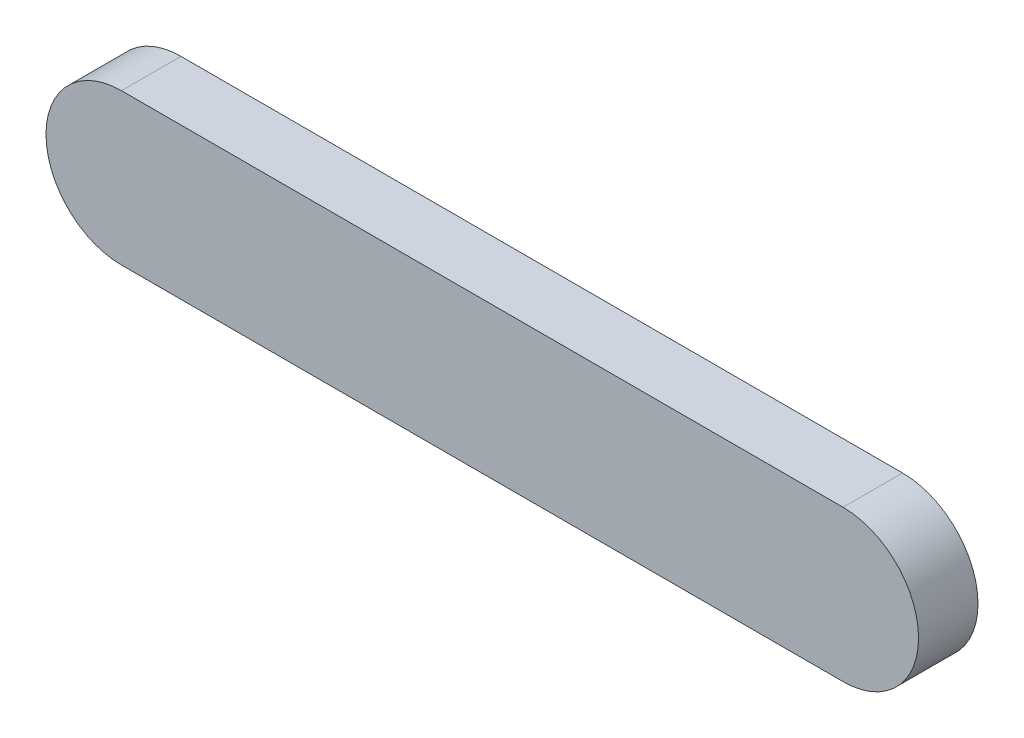
ISO-10303-21;
HEADER;
FILE_DESCRIPTION(('STEP AP214'),'2;1');
FILE_NAME('part.step','',(''),(''),'','','');
FILE_SCHEMA(('AUTOMOTIVE_DESIGN { 1 0 10303 214 1 1 1 1 }'));
ENDSEC;
DATA;
#1=APPLICATION_CONTEXT('core data for automotive mechanical design processes');
#2=APPLICATION_PROTOCOL_DEFINITION('international standard','automotive_design',2000,#1);
#3=PRODUCT_CONTEXT('',#1,'mechanical');
#4=PRODUCT('Part','Part','',(#3));
#5=PRODUCT_RELATED_PRODUCT_CATEGORY('part','',(#4));
#6=PRODUCT_DEFINITION_FORMATION('','',#4);
#7=PRODUCT_DEFINITION_CONTEXT('part definition',#1,'design');
#8=PRODUCT_DEFINITION('design','',#6,#7);
#9=PRODUCT_DEFINITION_SHAPE('','',#8);
#10=(LENGTH_UNIT() NAMED_UNIT(*) SI_UNIT(.MILLI.,.METRE.));
#11=(NAMED_UNIT(*) PLANE_ANGLE_UNIT() SI_UNIT($,.RADIAN.));
#12=(NAMED_UNIT(*) SI_UNIT($,.STERADIAN.) SOLID_ANGLE_UNIT());
#13=UNCERTAINTY_MEASURE_WITH_UNIT(LENGTH_MEASURE(1.E-05),#10,'distance_accuracy_value','');
#14=(GEOMETRIC_REPRESENTATION_CONTEXT(3) GLOBAL_UNCERTAINTY_ASSIGNED_CONTEXT((#13)) GLOBAL_UNIT_ASSIGNED_CONTEXT((#10,
#11,#12)) REPRESENTATION_CONTEXT('',''));
#15=CARTESIAN_POINT('',(0.,0.,0.));
#16=DIRECTION('',(0.,0.,1.));
#17=DIRECTION('',(1.,0.,0.));
#18=AXIS2_PLACEMENT_3D('',#15,#16,#17);
#19=CARTESIAN_POINT('',(149.3012,56.388,0.));
#20=DIRECTION('',(0.,1.,0.));
#21=DIRECTION('',(1.,0.,0.));
#22=AXIS2_PLACEMENT_3D('',#19,#20,#21);
#23=PLANE('',#22);
#24=DIRECTION('',(1.,0.,0.));
#25=VECTOR('',#24,1.);
#26=CARTESIAN_POINT('',(149.3012,56.388,0.1999996));
#27=LINE('',#26,#25);
#28=CARTESIAN_POINT('',(149.3012,56.388,0.1999996));
#29=VERTEX_POINT('',#28);
#30=CARTESIAN_POINT('',(151.7284748,56.388,0.1999996));
#31=VERTEX_POINT('',#30);
#32=EDGE_CURVE('E11',#29,#31,#27,.T.);
#33=ORIENTED_EDGE('',*,*,#32,.F.);
#34=DIRECTION('',(0.,0.,1.));
#35=VECTOR('',#34,1.);
#36=CARTESIAN_POINT('',(149.3012,56.388,0.));
#37=LINE('',#36,#35);
#38=CARTESIAN_POINT('',(149.3012,56.388,0.));
#39=VERTEX_POINT('',#38);
#40=EDGE_CURVE('E24',#39,#29,#37,.T.);
#41=ORIENTED_EDGE('',*,*,#40,.F.);
#42=DIRECTION('',(1.,0.,0.));
#43=VECTOR('',#42,1.);
#44=CARTESIAN_POINT('',(149.3012,56.388,0.));
#45=LINE('',#44,#43);
#46=CARTESIAN_POINT('',(151.7284748,56.388,0.));
#47=VERTEX_POINT('',#46);
#48=EDGE_CURVE('E75',#39,#47,#45,.T.);
#49=ORIENTED_EDGE('',*,*,#48,.T.);
#50=DIRECTION('',(0.,0.,1.));
#51=VECTOR('',#50,1.);
#52=CARTESIAN_POINT('',(151.7284748,56.388,0.));
#53=LINE('',#52,#51);
#54=EDGE_CURVE('E37',#47,#31,#53,.T.);
#55=ORIENTED_EDGE('',*,*,#54,.T.);
#56=EDGE_LOOP('',(#33,#41,#49,#55));
#57=FACE_BOUND('',#56,.T.);
#58=ADVANCED_FACE('F17',(#57),#23,.F.);
#59=CARTESIAN_POINT('',(151.7284748,56.642,0.));
#60=DIRECTION('',(0.,0.,-1.));
#61=DIRECTION('',(1.11896493820486E-13,-1.,0.));
#62=AXIS2_PLACEMENT_3D('',#59,#60,#61);
#63=CYLINDRICAL_SURFACE('',#62,0.254000000000007);
#64=CARTESIAN_POINT('',(151.7284748,56.642,0.1999996));
#65=DIRECTION('',(0.,0.,1.));
#66=DIRECTION('',(1.11896493820486E-13,-1.,0.));
#67=AXIS2_PLACEMENT_3D('',#64,#65,#66);
#68=CIRCLE('',#67,0.254000000000007);
#69=CARTESIAN_POINT('',(151.7284748,56.896,0.1999996));
#70=VERTEX_POINT('',#69);
#71=EDGE_CURVE('E83',#31,#70,#68,.T.);
#72=ORIENTED_EDGE('',*,*,#71,.F.);
#73=ORIENTED_EDGE('',*,*,#54,.F.);
#74=CARTESIAN_POINT('',(151.7284748,56.642,0.));
#75=DIRECTION('',(0.,0.,1.));
#76=DIRECTION('',(1.11896493820486E-13,-1.,0.));
#77=AXIS2_PLACEMENT_3D('',#74,#75,#76);
#78=CIRCLE('',#77,0.254000000000007);
#79=CARTESIAN_POINT('',(151.7284748,56.896,0.));
#80=VERTEX_POINT('',#79);
#81=EDGE_CURVE('E81',#47,#80,#78,.T.);
#82=ORIENTED_EDGE('',*,*,#81,.T.);
#83=DIRECTION('',(0.,0.,1.));
#84=VECTOR('',#83,1.);
#85=CARTESIAN_POINT('',(151.7284748,56.896,0.));
#86=LINE('',#85,#84);
#87=EDGE_CURVE('E67',#80,#70,#86,.T.);
#88=ORIENTED_EDGE('',*,*,#87,.T.);
#89=EDGE_LOOP('',(#72,#73,#82,#88));
#90=FACE_BOUND('',#89,.T.);
#91=ADVANCED_FACE('F89',(#90),#63,.T.);
#92=CARTESIAN_POINT('',(151.7284748,56.896,0.));
#93=DIRECTION('',(0.,-1.,0.));
#94=DIRECTION('',(-1.,0.,0.));
#95=AXIS2_PLACEMENT_3D('',#92,#93,#94);
#96=PLANE('',#95);
#97=DIRECTION('',(-1.,0.,0.));
#98=VECTOR('',#97,1.);
#99=CARTESIAN_POINT('',(151.7284748,56.896,0.1999996));
#100=LINE('',#99,#98);
#101=CARTESIAN_POINT('',(149.3012,56.896,0.1999996));
#102=VERTEX_POINT('',#101);
#103=EDGE_CURVE('E71',#70,#102,#100,.T.);
#104=ORIENTED_EDGE('',*,*,#103,.F.);
#105=ORIENTED_EDGE('',*,*,#87,.F.);
#106=DIRECTION('',(-1.,0.,0.));
#107=VECTOR('',#106,1.);
#108=CARTESIAN_POINT('',(151.7284748,56.896,0.));
#109=LINE('',#108,#107);
#110=CARTESIAN_POINT('',(149.3012,56.896,0.));
#111=VERTEX_POINT('',#110);
#112=EDGE_CURVE('E63',#80,#111,#109,.T.);
#113=ORIENTED_EDGE('',*,*,#112,.T.);
#114=DIRECTION('',(0.,0.,1.));
#115=VECTOR('',#114,1.);
#116=CARTESIAN_POINT('',(149.3012,56.896,0.));
#117=LINE('',#116,#115);
#118=EDGE_CURVE('E53',#111,#102,#117,.T.);
#119=ORIENTED_EDGE('',*,*,#118,.T.);
#120=EDGE_LOOP('',(#104,#105,#113,#119));
#121=FACE_BOUND('',#120,.T.);
#122=ADVANCED_FACE('F66',(#121),#96,.F.);
#123=CARTESIAN_POINT('',(149.3012,56.642,0.));
#124=DIRECTION('',(0.,0.,-1.));
#125=DIRECTION('',(0.,1.,0.));
#126=AXIS2_PLACEMENT_3D('',#123,#124,#125);
#127=CYLINDRICAL_SURFACE('',#126,0.253999999999998);
#128=CARTESIAN_POINT('',(149.3012,56.642,0.1999996));
#129=DIRECTION('',(0.,0.,1.));
#130=DIRECTION('',(0.,1.,0.));
#131=AXIS2_PLACEMENT_3D('',#128,#129,#130);
#132=CIRCLE('',#131,0.253999999999998);
#133=EDGE_CURVE('E59',#102,#29,#132,.T.);
#134=ORIENTED_EDGE('',*,*,#133,.F.);
#135=ORIENTED_EDGE('',*,*,#118,.F.);
#136=CARTESIAN_POINT('',(149.3012,56.642,0.));
#137=DIRECTION('',(0.,0.,1.));
#138=DIRECTION('',(0.,1.,0.));
#139=AXIS2_PLACEMENT_3D('',#136,#137,#138);
#140=CIRCLE('',#139,0.253999999999998);
#141=EDGE_CURVE('E57',#111,#39,#140,.T.);
#142=ORIENTED_EDGE('',*,*,#141,.T.);
#143=ORIENTED_EDGE('',*,*,#40,.T.);
#144=EDGE_LOOP('',(#134,#135,#142,#143));
#145=FACE_BOUND('',#144,.T.);
#146=ADVANCED_FACE('F55',(#145),#127,.T.);
#147=CARTESIAN_POINT('',(149.3012,56.388,0.));
#148=DIRECTION('',(0.,0.,-1.));
#149=DIRECTION('',(-1.,0.,0.));
#150=AXIS2_PLACEMENT_3D('',#147,#148,#149);
#151=PLANE('',#150);
#152=ORIENTED_EDGE('',*,*,#141,.F.);
#153=ORIENTED_EDGE('',*,*,#112,.F.);
#154=ORIENTED_EDGE('',*,*,#81,.F.);
#155=ORIENTED_EDGE('',*,*,#48,.F.);
#156=EDGE_LOOP('',(#152,#153,#154,#155));
#157=FACE_BOUND('',#156,.T.);
#158=ADVANCED_FACE('F74',(#157),#151,.T.);
#159=CARTESIAN_POINT('',(149.3012,56.388,0.1999996));
#160=DIRECTION('',(0.,0.,-1.));
#161=DIRECTION('',(-1.,0.,0.));
#162=AXIS2_PLACEMENT_3D('',#159,#160,#161);
#163=PLANE('',#162);
#164=ORIENTED_EDGE('',*,*,#32,.T.);
#165=ORIENTED_EDGE('',*,*,#71,.T.);
#166=ORIENTED_EDGE('',*,*,#103,.T.);
#167=ORIENTED_EDGE('',*,*,#133,.T.);
#168=EDGE_LOOP('',(#164,#165,#166,#167));
#169=FACE_BOUND('',#168,.T.);
#170=ADVANCED_FACE('F91',(#169),#163,.F.);
#171=CLOSED_SHELL('',(#58,#91,#122,#146,#158,#170));
#172=MANIFOLD_SOLID_BREP('B1',#171);
#173=ADVANCED_BREP_SHAPE_REPRESENTATION('',(#18,#172),#14);
#174=SHAPE_DEFINITION_REPRESENTATION(#9,#173);
ENDSEC;
END-ISO-10303-21;
